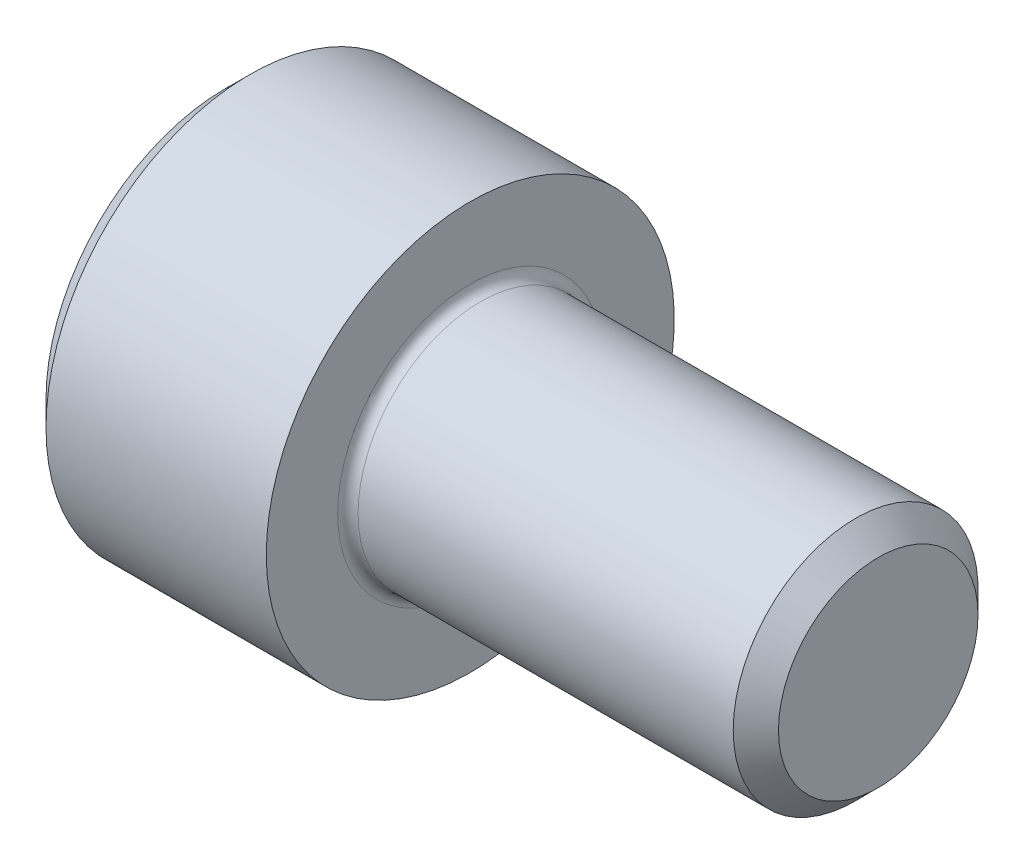
ISO-10303-21;
HEADER;
FILE_DESCRIPTION(('STEP AP214'),'2;1');
FILE_NAME('part.step','',(''),(''),'','','');
FILE_SCHEMA(('AUTOMOTIVE_DESIGN { 1 0 10303 214 1 1 1 1 }'));
ENDSEC;
DATA;
#1=APPLICATION_CONTEXT('core data for automotive mechanical design processes');
#2=APPLICATION_PROTOCOL_DEFINITION('international standard','automotive_design',2000,#1);
#3=PRODUCT_CONTEXT('',#1,'mechanical');
#4=PRODUCT('Part','Part','',(#3));
#5=PRODUCT_RELATED_PRODUCT_CATEGORY('part','',(#4));
#6=PRODUCT_DEFINITION_FORMATION('','',#4);
#7=PRODUCT_DEFINITION_CONTEXT('part definition',#1,'design');
#8=PRODUCT_DEFINITION('design','',#6,#7);
#9=PRODUCT_DEFINITION_SHAPE('','',#8);
#10=(LENGTH_UNIT() NAMED_UNIT(*) SI_UNIT(.MILLI.,.METRE.));
#11=(NAMED_UNIT(*) PLANE_ANGLE_UNIT() SI_UNIT($,.RADIAN.));
#12=(NAMED_UNIT(*) SI_UNIT($,.STERADIAN.) SOLID_ANGLE_UNIT());
#13=UNCERTAINTY_MEASURE_WITH_UNIT(LENGTH_MEASURE(1.E-05),#10,'distance_accuracy_value','');
#14=(GEOMETRIC_REPRESENTATION_CONTEXT(3) GLOBAL_UNCERTAINTY_ASSIGNED_CONTEXT((#13)) GLOBAL_UNIT_ASSIGNED_CONTEXT((#10,
#11,#12)) REPRESENTATION_CONTEXT('',''));
#15=CARTESIAN_POINT('',(0.,0.,0.));
#16=DIRECTION('',(0.,0.,1.));
#17=DIRECTION('',(1.,0.,0.));
#18=AXIS2_PLACEMENT_3D('',#15,#16,#17);
#19=CARTESIAN_POINT('',(0.,0.,0.));
#20=DIRECTION('',(-1.,0.,0.));
#21=DIRECTION('',(0.,0.,1.));
#22=AXIS2_PLACEMENT_3D('',#19,#20,#21);
#23=PLANE('',#22);
#24=DIRECTION('',(0.,-0.499999999999999,0.866025403784439));
#25=VECTOR('',#24,1.);
#26=CARTESIAN_POINT('',(0.,2.93524876856005,0.));
#27=LINE('',#26,#25);
#28=CARTESIAN_POINT('',(0.,2.93524876856005,0.));
#29=VERTEX_POINT('',#28);
#30=CARTESIAN_POINT('',(0.,1.46762438428003,2.542));
#31=VERTEX_POINT('',#30);
#32=EDGE_CURVE('E387',#29,#31,#27,.T.);
#33=ORIENTED_EDGE('',*,*,#32,.T.);
#34=DIRECTION('',(0.,1.,0.));
#35=VECTOR('',#34,1.);
#36=CARTESIAN_POINT('',(0.,-1.46762438428003,2.542));
#37=LINE('',#36,#35);
#38=CARTESIAN_POINT('',(0.,-1.46762438428003,2.542));
#39=VERTEX_POINT('',#38);
#40=EDGE_CURVE('E131',#39,#31,#37,.T.);
#41=ORIENTED_EDGE('',*,*,#40,.F.);
#42=DIRECTION('',(0.,-0.500000000000001,-0.866025403784438));
#43=VECTOR('',#42,1.);
#44=CARTESIAN_POINT('',(0.,-1.46762438428003,2.542));
#45=LINE('',#44,#43);
#46=CARTESIAN_POINT('',(0.,-2.93524876856006,0.));
#47=VERTEX_POINT('',#46);
#48=EDGE_CURVE('E390',#39,#47,#45,.T.);
#49=ORIENTED_EDGE('',*,*,#48,.T.);
#50=DIRECTION('',(0.,0.499999999999998,-0.866025403784439));
#51=VECTOR('',#50,1.);
#52=CARTESIAN_POINT('',(0.,-2.93524876856006,0.));
#53=LINE('',#52,#51);
#54=CARTESIAN_POINT('',(0.,-1.46762438428004,-2.542));
#55=VERTEX_POINT('',#54);
#56=EDGE_CURVE('E393',#47,#55,#53,.T.);
#57=ORIENTED_EDGE('',*,*,#56,.T.);
#58=DIRECTION('',(0.,-1.,0.));
#59=VECTOR('',#58,1.);
#60=CARTESIAN_POINT('',(0.,1.46762438428002,-2.542));
#61=LINE('',#60,#59);
#62=CARTESIAN_POINT('',(0.,1.46762438428002,-2.542));
#63=VERTEX_POINT('',#62);
#64=EDGE_CURVE('E396',#63,#55,#61,.T.);
#65=ORIENTED_EDGE('',*,*,#64,.F.);
#66=DIRECTION('',(0.,-0.500000000000001,-0.866025403784438));
#67=VECTOR('',#66,1.);
#68=CARTESIAN_POINT('',(0.,2.93524876856005,0.));
#69=LINE('',#68,#67);
#70=EDGE_CURVE('E126',#29,#63,#69,.T.);
#71=ORIENTED_EDGE('',*,*,#70,.F.);
#72=EDGE_LOOP('',(#33,#41,#49,#57,#65,#71));
#73=FACE_BOUND('',#72,.T.);
#74=CARTESIAN_POINT('',(0.,0.,0.));
#75=DIRECTION('',(-1.,0.,0.));
#76=DIRECTION('',(0.,0.,1.));
#77=AXIS2_PLACEMENT_3D('',#74,#75,#76);
#78=CIRCLE('',#77,4.4);
#79=CARTESIAN_POINT('',(0.,0.,4.4));
#80=VERTEX_POINT('',#79);
#81=EDGE_CURVE('E142',#80,#80,#78,.T.);
#82=ORIENTED_EDGE('',*,*,#81,.T.);
#83=EDGE_LOOP('',(#82));
#84=FACE_BOUND('',#83,.T.);
#85=ADVANCED_FACE('F35',(#73,#84),#23,.T.);
#86=CARTESIAN_POINT('',(16.,2.4455,0.));
#87=DIRECTION('',(1.,0.,0.));
#88=DIRECTION('',(0.,0.,-1.));
#89=AXIS2_PLACEMENT_3D('',#86,#87,#88);
#90=PLANE('',#89);
#91=CARTESIAN_POINT('',(16.,0.,0.));
#92=DIRECTION('',(-1.,0.,0.));
#93=DIRECTION('',(0.,0.,1.));
#94=AXIS2_PLACEMENT_3D('',#91,#92,#93);
#95=CIRCLE('',#94,2.4455);
#96=CARTESIAN_POINT('',(16.,0.,2.4455));
#97=VERTEX_POINT('',#96);
#98=EDGE_CURVE('E155',#97,#97,#95,.T.);
#99=ORIENTED_EDGE('',*,*,#98,.F.);
#100=EDGE_LOOP('',(#99));
#101=FACE_BOUND('',#100,.T.);
#102=ADVANCED_FACE('F176',(#101),#90,.T.);
#103=CARTESIAN_POINT('',(16.,0.,0.));
#104=DIRECTION('',(-1.,0.,0.));
#105=DIRECTION('',(0.,0.,1.));
#106=AXIS2_PLACEMENT_3D('',#103,#104,#105);
#107=CONICAL_SURFACE('',#106,2.4455,0.785398163397468);
#108=CARTESIAN_POINT('',(15.4455,0.,0.));
#109=DIRECTION('',(-1.,0.,0.));
#110=DIRECTION('',(0.,0.,1.));
#111=AXIS2_PLACEMENT_3D('',#108,#109,#110);
#112=CIRCLE('',#111,3.);
#113=CARTESIAN_POINT('',(15.4455,0.,3.));
#114=VERTEX_POINT('',#113);
#115=EDGE_CURVE('E152',#114,#114,#112,.T.);
#116=ORIENTED_EDGE('',*,*,#115,.F.);
#117=EDGE_LOOP('',(#116));
#118=FACE_BOUND('',#117,.T.);
#119=ORIENTED_EDGE('',*,*,#98,.T.);
#120=EDGE_LOOP('',(#119));
#121=FACE_BOUND('',#120,.T.);
#122=ADVANCED_FACE('F182',(#118,#121),#107,.T.);
#123=CARTESIAN_POINT('',(-31.75,0.,0.));
#124=DIRECTION('',(-1.,0.,0.));
#125=DIRECTION('',(0.,0.,1.));
#126=AXIS2_PLACEMENT_3D('',#123,#124,#125);
#127=CYLINDRICAL_SURFACE('',#126,3.);
#128=CARTESIAN_POINT('',(6.25,0.,0.));
#129=DIRECTION('',(1.,0.,0.));
#130=DIRECTION('',(0.,0.,-1.));
#131=AXIS2_PLACEMENT_3D('',#128,#129,#130);
#132=CIRCLE('',#131,3.);
#133=CARTESIAN_POINT('',(6.25,0.,-3.));
#134=VERTEX_POINT('',#133);
#135=EDGE_CURVE('E11',#134,#134,#132,.T.);
#136=ORIENTED_EDGE('',*,*,#135,.T.);
#137=EDGE_LOOP('',(#136));
#138=FACE_BOUND('',#137,.T.);
#139=ORIENTED_EDGE('',*,*,#115,.T.);
#140=EDGE_LOOP('',(#139));
#141=FACE_BOUND('',#140,.T.);
#142=ADVANCED_FACE('F193',(#138,#141),#127,.T.);
#143=CARTESIAN_POINT('',(6.,5.,0.));
#144=DIRECTION('',(1.,0.,0.));
#145=DIRECTION('',(0.,0.,-1.));
#146=AXIS2_PLACEMENT_3D('',#143,#144,#145);
#147=PLANE('',#146);
#148=CARTESIAN_POINT('',(6.,0.,0.));
#149=DIRECTION('',(1.,0.,0.));
#150=DIRECTION('',(0.,0.,-1.));
#151=AXIS2_PLACEMENT_3D('',#148,#149,#150);
#152=CIRCLE('',#151,3.25);
#153=CARTESIAN_POINT('',(6.,0.,-3.25));
#154=VERTEX_POINT('',#153);
#155=EDGE_CURVE('E43',#154,#154,#152,.F.);
#156=ORIENTED_EDGE('',*,*,#155,.T.);
#157=EDGE_LOOP('',(#156));
#158=FACE_BOUND('',#157,.T.);
#159=CARTESIAN_POINT('',(6.,0.,0.));
#160=DIRECTION('',(-1.,0.,0.));
#161=DIRECTION('',(0.,0.,1.));
#162=AXIS2_PLACEMENT_3D('',#159,#160,#161);
#163=CIRCLE('',#162,5.);
#164=CARTESIAN_POINT('',(6.,0.,5.));
#165=VERTEX_POINT('',#164);
#166=EDGE_CURVE('E149',#165,#165,#163,.T.);
#167=ORIENTED_EDGE('',*,*,#166,.F.);
#168=EDGE_LOOP('',(#167));
#169=FACE_BOUND('',#168,.T.);
#170=ADVANCED_FACE('F160',(#158,#169),#147,.T.);
#171=CARTESIAN_POINT('',(-31.75,0.,0.));
#172=DIRECTION('',(-1.,0.,0.));
#173=DIRECTION('',(0.,0.,1.));
#174=AXIS2_PLACEMENT_3D('',#171,#172,#173);
#175=CYLINDRICAL_SURFACE('',#174,5.);
#176=ORIENTED_EDGE('',*,*,#166,.T.);
#177=EDGE_LOOP('',(#176));
#178=FACE_BOUND('',#177,.T.);
#179=CARTESIAN_POINT('',(0.600000000000003,0.,0.));
#180=DIRECTION('',(-1.,0.,0.));
#181=DIRECTION('',(0.,0.,1.));
#182=AXIS2_PLACEMENT_3D('',#179,#180,#181);
#183=CIRCLE('',#182,5.);
#184=CARTESIAN_POINT('',(0.600000000000003,0.,5.));
#185=VERTEX_POINT('',#184);
#186=EDGE_CURVE('E146',#185,#185,#183,.T.);
#187=ORIENTED_EDGE('',*,*,#186,.F.);
#188=EDGE_LOOP('',(#187));
#189=FACE_BOUND('',#188,.T.);
#190=ADVANCED_FACE('F171',(#178,#189),#175,.T.);
#191=CARTESIAN_POINT('',(0.,0.,0.));
#192=DIRECTION('',(1.,0.,0.));
#193=DIRECTION('',(0.,0.,-1.));
#194=AXIS2_PLACEMENT_3D('',#191,#192,#193);
#195=CONICAL_SURFACE('',#194,4.4,0.785398163397445);
#196=ORIENTED_EDGE('',*,*,#186,.T.);
#197=EDGE_LOOP('',(#196));
#198=FACE_BOUND('',#197,.T.);
#199=ORIENTED_EDGE('',*,*,#81,.F.);
#200=EDGE_LOOP('',(#199));
#201=FACE_BOUND('',#200,.T.);
#202=ADVANCED_FACE('F164',(#198,#201),#195,.T.);
#203=CARTESIAN_POINT('',(6.25,0.,0.));
#204=DIRECTION('',(1.,0.,0.));
#205=DIRECTION('',(0.,0.,-1.));
#206=AXIS2_PLACEMENT_3D('',#203,#204,#205);
#207=TOROIDAL_SURFACE('',#206,3.25,0.25);
#208=ORIENTED_EDGE('',*,*,#135,.F.);
#209=EDGE_LOOP('',(#208));
#210=FACE_BOUND('',#209,.T.);
#211=ORIENTED_EDGE('',*,*,#155,.F.);
#212=EDGE_LOOP('',(#211));
#213=FACE_BOUND('',#212,.T.);
#214=ADVANCED_FACE('F37',(#210,#213),#207,.F.);
#215=CARTESIAN_POINT('',(3.,2.93524876856005,0.));
#216=DIRECTION('',(0.,-0.866025403784439,-0.499999999999998));
#217=DIRECTION('',(0.,0.499999999999999,-0.86602540378444));
#218=AXIS2_PLACEMENT_3D('',#215,#216,#217);
#219=PLANE('',#218);
#220=ORIENTED_EDGE('',*,*,#32,.F.);
#221=DIRECTION('',(-1.,0.,0.));
#222=VECTOR('',#221,1.);
#223=CARTESIAN_POINT('',(3.,2.93524876856005,0.));
#224=LINE('',#223,#222);
#225=CARTESIAN_POINT('',(3.,2.93524876856005,0.));
#226=VERTEX_POINT('',#225);
#227=EDGE_CURVE('E377',#226,#29,#224,.T.);
#228=ORIENTED_EDGE('',*,*,#227,.F.);
#229=DIRECTION('',(0.,-0.499999999999999,0.866025403784439));
#230=VECTOR('',#229,1.);
#231=CARTESIAN_POINT('',(3.,2.93524876856005,0.));
#232=LINE('',#231,#230);
#233=CARTESIAN_POINT('',(3.,2.20143657642004,1.27099999999999));
#234=VERTEX_POINT('',#233);
#235=EDGE_CURVE('E118',#226,#234,#232,.T.);
#236=ORIENTED_EDGE('',*,*,#235,.T.);
#237=CARTESIAN_POINT('',(3.,1.46762438428003,2.542));
#238=VERTEX_POINT('',#237);
#239=EDGE_CURVE('E109',#234,#238,#232,.T.);
#240=ORIENTED_EDGE('',*,*,#239,.T.);
#241=DIRECTION('',(-1.,0.,0.));
#242=VECTOR('',#241,1.);
#243=CARTESIAN_POINT('',(3.,1.46762438428003,2.542));
#244=LINE('',#243,#242);
#245=EDGE_CURVE('E123',#238,#31,#244,.T.);
#246=ORIENTED_EDGE('',*,*,#245,.T.);
#247=EDGE_LOOP('',(#220,#228,#236,#240,#246));
#248=FACE_BOUND('',#247,.T.);
#249=ADVANCED_FACE('F122',(#248),#219,.T.);
#250=CARTESIAN_POINT('',(3.,-1.46762438428003,2.542));
#251=DIRECTION('',(0.,0.,1.));
#252=DIRECTION('',(0.,-1.,0.));
#253=AXIS2_PLACEMENT_3D('',#250,#251,#252);
#254=PLANE('',#253);
#255=ORIENTED_EDGE('',*,*,#40,.T.);
#256=ORIENTED_EDGE('',*,*,#245,.F.);
#257=DIRECTION('',(0.,1.,0.));
#258=VECTOR('',#257,1.);
#259=CARTESIAN_POINT('',(3.,-1.46762438428003,2.542));
#260=LINE('',#259,#258);
#261=CARTESIAN_POINT('',(3.,0.,2.542));
#262=VERTEX_POINT('',#261);
#263=EDGE_CURVE('E106',#262,#238,#260,.T.);
#264=ORIENTED_EDGE('',*,*,#263,.F.);
#265=CARTESIAN_POINT('',(3.,-1.46762438428003,2.542));
#266=VERTEX_POINT('',#265);
#267=EDGE_CURVE('E117',#266,#262,#260,.T.);
#268=ORIENTED_EDGE('',*,*,#267,.F.);
#269=DIRECTION('',(-1.,0.,0.));
#270=VECTOR('',#269,1.);
#271=CARTESIAN_POINT('',(3.,-1.46762438428003,2.542));
#272=LINE('',#271,#270);
#273=EDGE_CURVE('E133',#266,#39,#272,.T.);
#274=ORIENTED_EDGE('',*,*,#273,.T.);
#275=EDGE_LOOP('',(#255,#256,#264,#268,#274));
#276=FACE_BOUND('',#275,.T.);
#277=ADVANCED_FACE('F128',(#276),#254,.F.);
#278=CARTESIAN_POINT('',(3.,-1.46762438428003,2.542));
#279=DIRECTION('',(0.,0.866025403784438,-0.500000000000001));
#280=DIRECTION('',(0.,0.500000000000001,0.866025403784438));
#281=AXIS2_PLACEMENT_3D('',#278,#279,#280);
#282=PLANE('',#281);
#283=ORIENTED_EDGE('',*,*,#48,.F.);
#284=ORIENTED_EDGE('',*,*,#273,.F.);
#285=DIRECTION('',(0.,-0.500000000000001,-0.866025403784438));
#286=VECTOR('',#285,1.);
#287=CARTESIAN_POINT('',(3.,-1.46762438428003,2.542));
#288=LINE('',#287,#286);
#289=CARTESIAN_POINT('',(3.,-2.20143657642004,1.271));
#290=VERTEX_POINT('',#289);
#291=EDGE_CURVE('E416',#266,#290,#288,.T.);
#292=ORIENTED_EDGE('',*,*,#291,.T.);
#293=CARTESIAN_POINT('',(3.,-2.93524876856006,0.));
#294=VERTEX_POINT('',#293);
#295=EDGE_CURVE('E405',#290,#294,#288,.T.);
#296=ORIENTED_EDGE('',*,*,#295,.T.);
#297=DIRECTION('',(-1.,0.,0.));
#298=VECTOR('',#297,1.);
#299=CARTESIAN_POINT('',(3.,-2.93524876856006,0.));
#300=LINE('',#299,#298);
#301=EDGE_CURVE('E138',#294,#47,#300,.T.);
#302=ORIENTED_EDGE('',*,*,#301,.T.);
#303=EDGE_LOOP('',(#283,#284,#292,#296,#302));
#304=FACE_BOUND('',#303,.T.);
#305=ADVANCED_FACE('F268',(#304),#282,.T.);
#306=CARTESIAN_POINT('',(3.,-2.93524876856006,0.));
#307=DIRECTION('',(0.,0.86602540378444,0.499999999999998));
#308=DIRECTION('',(0.,-0.499999999999998,0.86602540378444));
#309=AXIS2_PLACEMENT_3D('',#306,#307,#308);
#310=PLANE('',#309);
#311=ORIENTED_EDGE('',*,*,#56,.F.);
#312=ORIENTED_EDGE('',*,*,#301,.F.);
#313=DIRECTION('',(0.,0.499999999999998,-0.866025403784439));
#314=VECTOR('',#313,1.);
#315=CARTESIAN_POINT('',(3.,-2.93524876856006,0.));
#316=LINE('',#315,#314);
#317=CARTESIAN_POINT('',(3.,-2.20143657642005,-1.271));
#318=VERTEX_POINT('',#317);
#319=EDGE_CURVE('E383',#294,#318,#316,.T.);
#320=ORIENTED_EDGE('',*,*,#319,.T.);
#321=CARTESIAN_POINT('',(3.,-1.46762438428004,-2.542));
#322=VERTEX_POINT('',#321);
#323=EDGE_CURVE('E415',#318,#322,#316,.T.);
#324=ORIENTED_EDGE('',*,*,#323,.T.);
#325=DIRECTION('',(-1.,0.,0.));
#326=VECTOR('',#325,1.);
#327=CARTESIAN_POINT('',(3.,-1.46762438428004,-2.542));
#328=LINE('',#327,#326);
#329=EDGE_CURVE('E376',#322,#55,#328,.T.);
#330=ORIENTED_EDGE('',*,*,#329,.T.);
#331=EDGE_LOOP('',(#311,#312,#320,#324,#330));
#332=FACE_BOUND('',#331,.T.);
#333=ADVANCED_FACE('F276',(#332),#310,.T.);
#334=CARTESIAN_POINT('',(3.,1.46762438428002,-2.542));
#335=DIRECTION('',(0.,0.,-1.));
#336=DIRECTION('',(0.,1.,0.));
#337=AXIS2_PLACEMENT_3D('',#334,#335,#336);
#338=PLANE('',#337);
#339=ORIENTED_EDGE('',*,*,#64,.T.);
#340=ORIENTED_EDGE('',*,*,#329,.F.);
#341=DIRECTION('',(0.,-1.,0.));
#342=VECTOR('',#341,1.);
#343=CARTESIAN_POINT('',(3.,1.46762438428002,-2.542));
#344=LINE('',#343,#342);
#345=CARTESIAN_POINT('',(3.,0.,-2.542));
#346=VERTEX_POINT('',#345);
#347=EDGE_CURVE('E380',#346,#322,#344,.T.);
#348=ORIENTED_EDGE('',*,*,#347,.F.);
#349=CARTESIAN_POINT('',(3.,1.46762438428002,-2.542));
#350=VERTEX_POINT('',#349);
#351=EDGE_CURVE('E50',#350,#346,#344,.T.);
#352=ORIENTED_EDGE('',*,*,#351,.F.);
#353=DIRECTION('',(-1.,0.,0.));
#354=VECTOR('',#353,1.);
#355=CARTESIAN_POINT('',(3.,1.46762438428002,-2.542));
#356=LINE('',#355,#354);
#357=EDGE_CURVE('E373',#350,#63,#356,.T.);
#358=ORIENTED_EDGE('',*,*,#357,.T.);
#359=EDGE_LOOP('',(#339,#340,#348,#352,#358));
#360=FACE_BOUND('',#359,.T.);
#361=ADVANCED_FACE('F285',(#360),#338,.F.);
#362=CARTESIAN_POINT('',(3.,2.93524876856005,0.));
#363=DIRECTION('',(0.,0.866025403784438,-0.500000000000001));
#364=DIRECTION('',(0.,0.500000000000001,0.866025403784438));
#365=AXIS2_PLACEMENT_3D('',#362,#363,#364);
#366=PLANE('',#365);
#367=ORIENTED_EDGE('',*,*,#70,.T.);
#368=ORIENTED_EDGE('',*,*,#357,.F.);
#369=DIRECTION('',(0.,-0.500000000000001,-0.866025403784438));
#370=VECTOR('',#369,1.);
#371=CARTESIAN_POINT('',(3.,2.93524876856005,0.));
#372=LINE('',#371,#370);
#373=CARTESIAN_POINT('',(3.,2.20143657642004,-1.271));
#374=VERTEX_POINT('',#373);
#375=EDGE_CURVE('E363',#374,#350,#372,.T.);
#376=ORIENTED_EDGE('',*,*,#375,.F.);
#377=EDGE_CURVE('E369',#226,#374,#372,.T.);
#378=ORIENTED_EDGE('',*,*,#377,.F.);
#379=ORIENTED_EDGE('',*,*,#227,.T.);
#380=EDGE_LOOP('',(#367,#368,#376,#378,#379));
#381=FACE_BOUND('',#380,.T.);
#382=ADVANCED_FACE('F294',(#381),#366,.F.);
#383=CARTESIAN_POINT('',(3.,4.40287315284008,-2.54200000000001));
#384=DIRECTION('',(1.,0.,0.));
#385=DIRECTION('',(0.,0.,-1.));
#386=AXIS2_PLACEMENT_3D('',#383,#384,#385);
#387=PLANE('',#386);
#388=ORIENTED_EDGE('',*,*,#347,.T.);
#389=ORIENTED_EDGE('',*,*,#323,.F.);
#390=CARTESIAN_POINT('',(3.,0.,0.));
#391=DIRECTION('',(-1.,0.,0.));
#392=DIRECTION('',(0.,0.,1.));
#393=AXIS2_PLACEMENT_3D('',#390,#391,#392);
#394=CIRCLE('',#393,2.542);
#395=EDGE_CURVE('E411',#346,#318,#394,.T.);
#396=ORIENTED_EDGE('',*,*,#395,.F.);
#397=EDGE_LOOP('',(#388,#389,#396));
#398=FACE_BOUND('',#397,.T.);
#399=ADVANCED_FACE('F303',(#398),#387,.F.);
#400=ORIENTED_EDGE('',*,*,#319,.F.);
#401=ORIENTED_EDGE('',*,*,#295,.F.);
#402=EDGE_CURVE('E136',#318,#290,#394,.T.);
#403=ORIENTED_EDGE('',*,*,#402,.F.);
#404=EDGE_LOOP('',(#400,#401,#403));
#405=FACE_BOUND('',#404,.T.);
#406=ADVANCED_FACE('F312',(#405),#387,.F.);
#407=ORIENTED_EDGE('',*,*,#291,.F.);
#408=ORIENTED_EDGE('',*,*,#267,.T.);
#409=EDGE_CURVE('E132',#290,#262,#394,.T.);
#410=ORIENTED_EDGE('',*,*,#409,.F.);
#411=EDGE_LOOP('',(#407,#408,#410));
#412=FACE_BOUND('',#411,.T.);
#413=ADVANCED_FACE('F321',(#412),#387,.F.);
#414=ORIENTED_EDGE('',*,*,#263,.T.);
#415=ORIENTED_EDGE('',*,*,#239,.F.);
#416=EDGE_CURVE('E112',#262,#234,#394,.T.);
#417=ORIENTED_EDGE('',*,*,#416,.F.);
#418=EDGE_LOOP('',(#414,#415,#417));
#419=FACE_BOUND('',#418,.T.);
#420=ADVANCED_FACE('F108',(#419),#387,.F.);
#421=ORIENTED_EDGE('',*,*,#235,.F.);
#422=ORIENTED_EDGE('',*,*,#377,.T.);
#423=EDGE_CURVE('E143',#234,#374,#394,.T.);
#424=ORIENTED_EDGE('',*,*,#423,.F.);
#425=EDGE_LOOP('',(#421,#422,#424));
#426=FACE_BOUND('',#425,.T.);
#427=ADVANCED_FACE('F336',(#426),#387,.F.);
#428=ORIENTED_EDGE('',*,*,#375,.T.);
#429=ORIENTED_EDGE('',*,*,#351,.T.);
#430=EDGE_CURVE('E366',#374,#346,#394,.T.);
#431=ORIENTED_EDGE('',*,*,#430,.F.);
#432=EDGE_LOOP('',(#428,#429,#431));
#433=FACE_BOUND('',#432,.T.);
#434=ADVANCED_FACE('F251',(#433),#387,.F.);
#435=CARTESIAN_POINT('',(3.,0.,0.));
#436=DIRECTION('',(-1.,0.,0.));
#437=DIRECTION('',(0.,0.,1.));
#438=AXIS2_PLACEMENT_3D('',#435,#436,#437);
#439=CONICAL_SURFACE('',#438,2.542,1.04719755119659);
#440=CARTESIAN_POINT('',(4.46762438428004,0.,0.));
#441=VERTEX_POINT('',#440);
#442=VERTEX_LOOP('',#441);
#443=FACE_BOUND('',#442,.T.);
#444=ORIENTED_EDGE('',*,*,#416,.T.);
#445=ORIENTED_EDGE('',*,*,#423,.T.);
#446=ORIENTED_EDGE('',*,*,#430,.T.);
#447=ORIENTED_EDGE('',*,*,#395,.T.);
#448=ORIENTED_EDGE('',*,*,#402,.T.);
#449=ORIENTED_EDGE('',*,*,#409,.T.);
#450=EDGE_LOOP('',(#444,#445,#446,#447,#448,#449));
#451=FACE_BOUND('',#450,.T.);
#452=ADVANCED_FACE('F186',(#443,#451),#439,.F.);
#453=CLOSED_SHELL('',(#85,#102,#122,#142,#170,#190,#202,#214,#249,#277,#305,#333,#361,#382,#399,
#406,#413,#420,#427,#434,#452));
#454=MANIFOLD_SOLID_BREP('B2',#453);
#455=ADVANCED_BREP_SHAPE_REPRESENTATION('',(#18,#454),#14);
#456=SHAPE_DEFINITION_REPRESENTATION(#9,#455);
ENDSEC;
END-ISO-10303-21;
